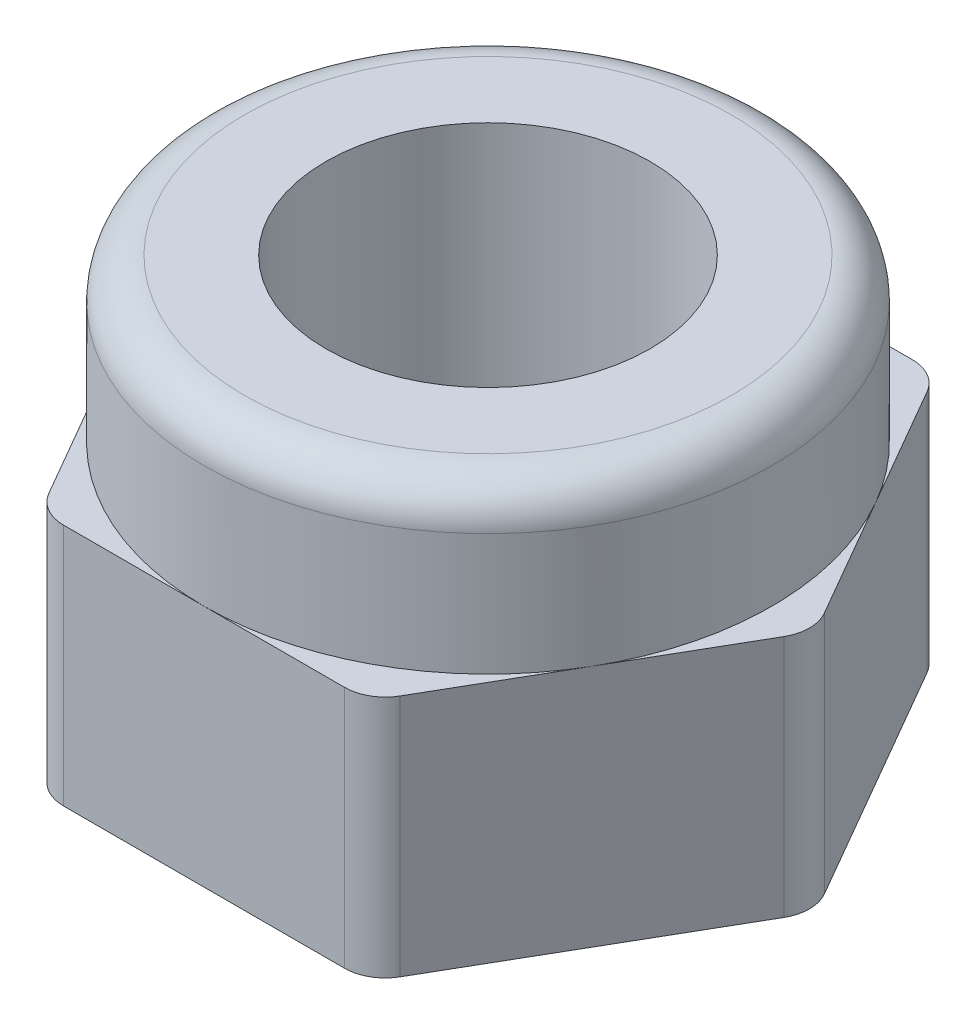
ISO-10303-21;
HEADER;
FILE_DESCRIPTION(('STEP AP214'),'2;1');
FILE_NAME('part.step','',(''),(''),'','','');
FILE_SCHEMA(('AUTOMOTIVE_DESIGN { 1 0 10303 214 1 1 1 1 }'));
ENDSEC;
DATA;
#1=APPLICATION_CONTEXT('core data for automotive mechanical design processes');
#2=APPLICATION_PROTOCOL_DEFINITION('international standard','automotive_design',2000,#1);
#3=PRODUCT_CONTEXT('',#1,'mechanical');
#4=PRODUCT('Part','Part','',(#3));
#5=PRODUCT_RELATED_PRODUCT_CATEGORY('part','',(#4));
#6=PRODUCT_DEFINITION_FORMATION('','',#4);
#7=PRODUCT_DEFINITION_CONTEXT('part definition',#1,'design');
#8=PRODUCT_DEFINITION('design','',#6,#7);
#9=PRODUCT_DEFINITION_SHAPE('','',#8);
#10=(LENGTH_UNIT() NAMED_UNIT(*) SI_UNIT(.MILLI.,.METRE.));
#11=(NAMED_UNIT(*) PLANE_ANGLE_UNIT() SI_UNIT($,.RADIAN.));
#12=(NAMED_UNIT(*) SI_UNIT($,.STERADIAN.) SOLID_ANGLE_UNIT());
#13=UNCERTAINTY_MEASURE_WITH_UNIT(LENGTH_MEASURE(1.E-05),#10,'distance_accuracy_value','');
#14=(GEOMETRIC_REPRESENTATION_CONTEXT(3) GLOBAL_UNCERTAINTY_ASSIGNED_CONTEXT((#13)) GLOBAL_UNIT_ASSIGNED_CONTEXT((#10,
#11,#12)) REPRESENTATION_CONTEXT('',''));
#15=CARTESIAN_POINT('',(0.,0.,0.));
#16=DIRECTION('',(0.,0.,1.));
#17=DIRECTION('',(1.,0.,0.));
#18=AXIS2_PLACEMENT_3D('',#15,#16,#17);
#19=CARTESIAN_POINT('',(0.,3.,0.));
#20=DIRECTION('',(0.,1.,0.));
#21=DIRECTION('',(0.,0.,1.));
#22=AXIS2_PLACEMENT_3D('',#19,#20,#21);
#23=PLANE('',#22);
#24=DIRECTION('',(1.,0.,0.));
#25=VECTOR('',#24,1.);
#26=CARTESIAN_POINT('',(-2.02072594216365,3.,3.50000000000001));
#27=LINE('',#26,#25);
#28=CARTESIAN_POINT('',(0.,3.,3.50000000000001));
#29=VERTEX_POINT('',#28);
#30=CARTESIAN_POINT('',(1.73205080756892,3.,3.49999999999998));
#31=VERTEX_POINT('',#30);
#32=EDGE_CURVE('E161',#29,#31,#27,.T.);
#33=ORIENTED_EDGE('',*,*,#32,.T.);
#34=CARTESIAN_POINT('',(1.73205080756891,3.,2.99999999999998));
#35=DIRECTION('',(0.,1.,0.));
#36=DIRECTION('',(0.,0.,1.));
#37=AXIS2_PLACEMENT_3D('',#34,#35,#36);
#38=CIRCLE('',#37,0.5);
#39=CARTESIAN_POINT('',(2.16506350946113,3.,3.24999999999997));
#40=VERTEX_POINT('',#39);
#41=EDGE_CURVE('E11',#31,#40,#38,.T.);
#42=ORIENTED_EDGE('',*,*,#41,.T.);
#43=DIRECTION('',(0.499999999999995,0.,-0.866025403784442));
#44=VECTOR('',#43,1.);
#45=CARTESIAN_POINT('',(2.02072594216373,3.,3.49999999999997));
#46=LINE('',#45,#44);
#47=CARTESIAN_POINT('',(3.03108891324555,3.,1.74999999999999));
#48=VERTEX_POINT('',#47);
#49=EDGE_CURVE('E172',#40,#48,#46,.T.);
#50=ORIENTED_EDGE('',*,*,#49,.T.);
#51=CARTESIAN_POINT('',(0.,3.,0.));
#52=DIRECTION('',(0.,1.,0.));
#53=DIRECTION('',(0.,0.,1.));
#54=AXIS2_PLACEMENT_3D('',#51,#52,#53);
#55=CIRCLE('',#54,3.50000000000001);
#56=EDGE_CURVE('E171',#29,#48,#55,.T.);
#57=ORIENTED_EDGE('',*,*,#56,.F.);
#58=EDGE_LOOP('',(#33,#42,#50,#57));
#59=FACE_BOUND('',#58,.T.);
#60=ADVANCED_FACE('F39',(#59),#23,.T.);
#61=CARTESIAN_POINT('',(3.89711431702997,3.,0.249999999999999));
#62=VERTEX_POINT('',#61);
#63=EDGE_CURVE('E198',#48,#62,#46,.T.);
#64=ORIENTED_EDGE('',*,*,#63,.T.);
#65=CARTESIAN_POINT('',(3.46410161513775,3.,0.));
#66=DIRECTION('',(0.,1.,0.));
#67=DIRECTION('',(0.,0.,1.));
#68=AXIS2_PLACEMENT_3D('',#65,#66,#67);
#69=CIRCLE('',#68,0.5);
#70=CARTESIAN_POINT('',(3.89711431702997,3.,-0.249999999999999));
#71=VERTEX_POINT('',#70);
#72=EDGE_CURVE('E48',#62,#71,#69,.T.);
#73=ORIENTED_EDGE('',*,*,#72,.T.);
#74=DIRECTION('',(-0.500000000000001,0.,-0.866025403784438));
#75=VECTOR('',#74,1.);
#76=CARTESIAN_POINT('',(4.04145188432738,3.,0.));
#77=LINE('',#76,#75);
#78=CARTESIAN_POINT('',(3.03108891324553,3.,-1.75));
#79=VERTEX_POINT('',#78);
#80=EDGE_CURVE('E199',#71,#79,#77,.T.);
#81=ORIENTED_EDGE('',*,*,#80,.T.);
#82=EDGE_CURVE('E180',#48,#79,#55,.T.);
#83=ORIENTED_EDGE('',*,*,#82,.F.);
#84=EDGE_LOOP('',(#64,#73,#81,#83));
#85=FACE_BOUND('',#84,.T.);
#86=ADVANCED_FACE('F313',(#85),#23,.T.);
#87=CARTESIAN_POINT('',(2.16506350946109,3.,-3.25));
#88=VERTEX_POINT('',#87);
#89=EDGE_CURVE('E197',#79,#88,#77,.T.);
#90=ORIENTED_EDGE('',*,*,#89,.T.);
#91=CARTESIAN_POINT('',(1.73205080756887,3.,-3.));
#92=DIRECTION('',(0.,1.,0.));
#93=DIRECTION('',(0.,0.,1.));
#94=AXIS2_PLACEMENT_3D('',#91,#92,#93);
#95=CIRCLE('',#94,0.5);
#96=CARTESIAN_POINT('',(1.73205080756887,3.,-3.5));
#97=VERTEX_POINT('',#96);
#98=EDGE_CURVE('E301',#88,#97,#95,.T.);
#99=ORIENTED_EDGE('',*,*,#98,.T.);
#100=DIRECTION('',(-1.,0.,0.));
#101=VECTOR('',#100,1.);
#102=CARTESIAN_POINT('',(2.02072594216368,3.,-3.5));
#103=LINE('',#102,#101);
#104=CARTESIAN_POINT('',(0.,3.,-3.49999999999999));
#105=VERTEX_POINT('',#104);
#106=EDGE_CURVE('E203',#97,#105,#103,.T.);
#107=ORIENTED_EDGE('',*,*,#106,.T.);
#108=EDGE_CURVE('E368',#79,#105,#55,.T.);
#109=ORIENTED_EDGE('',*,*,#108,.F.);
#110=EDGE_LOOP('',(#90,#99,#107,#109));
#111=FACE_BOUND('',#110,.T.);
#112=ADVANCED_FACE('F366',(#111),#23,.T.);
#113=CARTESIAN_POINT('',(-1.73205080756889,3.,-3.49999999999999));
#114=VERTEX_POINT('',#113);
#115=EDGE_CURVE('E202',#105,#114,#103,.T.);
#116=ORIENTED_EDGE('',*,*,#115,.T.);
#117=CARTESIAN_POINT('',(-1.73205080756889,3.,-2.99999999999999));
#118=DIRECTION('',(0.,1.,0.));
#119=DIRECTION('',(0.,0.,1.));
#120=AXIS2_PLACEMENT_3D('',#117,#118,#119);
#121=CIRCLE('',#120,0.5);
#122=CARTESIAN_POINT('',(-2.16506350946111,3.,-3.24999999999999));
#123=VERTEX_POINT('',#122);
#124=EDGE_CURVE('E291',#114,#123,#121,.T.);
#125=ORIENTED_EDGE('',*,*,#124,.T.);
#126=DIRECTION('',(-0.499999999999995,0.,0.866025403784442));
#127=VECTOR('',#126,1.);
#128=CARTESIAN_POINT('',(-2.0207259421637,3.,-3.49999999999999));
#129=LINE('',#128,#127);
#130=CARTESIAN_POINT('',(-3.03108891324554,3.,-1.74999999999998));
#131=VERTEX_POINT('',#130);
#132=EDGE_CURVE('E207',#123,#131,#129,.T.);
#133=ORIENTED_EDGE('',*,*,#132,.T.);
#134=EDGE_CURVE('E188',#105,#131,#55,.T.);
#135=ORIENTED_EDGE('',*,*,#134,.F.);
#136=EDGE_LOOP('',(#116,#125,#133,#135));
#137=FACE_BOUND('',#136,.T.);
#138=ADVANCED_FACE('F403',(#137),#23,.T.);
#139=CARTESIAN_POINT('',(-3.89711431702997,3.,-0.249999999999974));
#140=VERTEX_POINT('',#139);
#141=EDGE_CURVE('E206',#131,#140,#129,.T.);
#142=ORIENTED_EDGE('',*,*,#141,.T.);
#143=CARTESIAN_POINT('',(-3.46410161513775,3.,0.));
#144=DIRECTION('',(0.,1.,0.));
#145=DIRECTION('',(0.,0.,1.));
#146=AXIS2_PLACEMENT_3D('',#143,#144,#145);
#147=CIRCLE('',#146,0.5);
#148=CARTESIAN_POINT('',(-3.89711431702997,3.,0.250000000000028));
#149=VERTEX_POINT('',#148);
#150=EDGE_CURVE('E281',#140,#149,#147,.T.);
#151=ORIENTED_EDGE('',*,*,#150,.T.);
#152=DIRECTION('',(0.500000000000007,0.,0.866025403784435));
#153=VECTOR('',#152,1.);
#154=CARTESIAN_POINT('',(-4.04145188432738,3.,0.));
#155=LINE('',#154,#153);
#156=CARTESIAN_POINT('',(-3.03108891324552,3.,1.75000000000002));
#157=VERTEX_POINT('',#156);
#158=EDGE_CURVE('E169',#149,#157,#155,.T.);
#159=ORIENTED_EDGE('',*,*,#158,.T.);
#160=EDGE_CURVE('E185',#131,#157,#55,.T.);
#161=ORIENTED_EDGE('',*,*,#160,.F.);
#162=EDGE_LOOP('',(#142,#151,#159,#161));
#163=FACE_BOUND('',#162,.T.);
#164=ADVANCED_FACE('F398',(#163),#23,.T.);
#165=CARTESIAN_POINT('',(-2.16506350946106,3.,3.25000000000002));
#166=VERTEX_POINT('',#165);
#167=EDGE_CURVE('E210',#157,#166,#155,.T.);
#168=ORIENTED_EDGE('',*,*,#167,.T.);
#169=CARTESIAN_POINT('',(-1.73205080756885,3.,3.00000000000001));
#170=DIRECTION('',(0.,1.,0.));
#171=DIRECTION('',(0.,0.,1.));
#172=AXIS2_PLACEMENT_3D('',#169,#170,#171);
#173=CIRCLE('',#172,0.5);
#174=CARTESIAN_POINT('',(-1.73205080756884,3.,3.50000000000001));
#175=VERTEX_POINT('',#174);
#176=EDGE_CURVE('E156',#166,#175,#173,.T.);
#177=ORIENTED_EDGE('',*,*,#176,.T.);
#178=EDGE_CURVE('E148',#175,#29,#27,.T.);
#179=ORIENTED_EDGE('',*,*,#178,.T.);
#180=EDGE_CURVE('E153',#157,#29,#55,.T.);
#181=ORIENTED_EDGE('',*,*,#180,.F.);
#182=EDGE_LOOP('',(#168,#177,#179,#181));
#183=FACE_BOUND('',#182,.T.);
#184=ADVANCED_FACE('F151',(#183),#23,.T.);
#185=CARTESIAN_POINT('',(0.,0.,0.));
#186=DIRECTION('',(0.,1.,0.));
#187=DIRECTION('',(0.,0.,1.));
#188=AXIS2_PLACEMENT_3D('',#185,#186,#187);
#189=PLANE('',#188);
#190=DIRECTION('',(1.,0.,0.));
#191=VECTOR('',#190,1.);
#192=CARTESIAN_POINT('',(-2.02072594216365,0.,3.50000000000001));
#193=LINE('',#192,#191);
#194=CARTESIAN_POINT('',(-1.73205080756884,0.,3.50000000000001));
#195=VERTEX_POINT('',#194);
#196=CARTESIAN_POINT('',(1.73205080756892,0.,3.49999999999998));
#197=VERTEX_POINT('',#196);
#198=EDGE_CURVE('E231',#195,#197,#193,.T.);
#199=ORIENTED_EDGE('',*,*,#198,.F.);
#200=CARTESIAN_POINT('',(-1.73205080756885,0.,3.00000000000001));
#201=DIRECTION('',(0.,1.,0.));
#202=DIRECTION('',(0.,0.,1.));
#203=AXIS2_PLACEMENT_3D('',#200,#201,#202);
#204=CIRCLE('',#203,0.5);
#205=CARTESIAN_POINT('',(-2.16506350946106,0.,3.25000000000002));
#206=VERTEX_POINT('',#205);
#207=EDGE_CURVE('E262',#195,#206,#204,.F.);
#208=ORIENTED_EDGE('',*,*,#207,.T.);
#209=DIRECTION('',(0.500000000000007,0.,0.866025403784435));
#210=VECTOR('',#209,1.);
#211=CARTESIAN_POINT('',(-4.04145188432738,0.,0.));
#212=LINE('',#211,#210);
#213=CARTESIAN_POINT('',(-3.89711431702997,0.,0.250000000000028));
#214=VERTEX_POINT('',#213);
#215=EDGE_CURVE('E227',#214,#206,#212,.T.);
#216=ORIENTED_EDGE('',*,*,#215,.F.);
#217=CARTESIAN_POINT('',(-3.46410161513775,0.,0.));
#218=DIRECTION('',(0.,1.,0.));
#219=DIRECTION('',(0.,0.,1.));
#220=AXIS2_PLACEMENT_3D('',#217,#218,#219);
#221=CIRCLE('',#220,0.5);
#222=CARTESIAN_POINT('',(-3.89711431702997,0.,-0.249999999999974));
#223=VERTEX_POINT('',#222);
#224=EDGE_CURVE('E259',#214,#223,#221,.F.);
#225=ORIENTED_EDGE('',*,*,#224,.T.);
#226=DIRECTION('',(-0.499999999999995,0.,0.866025403784442));
#227=VECTOR('',#226,1.);
#228=CARTESIAN_POINT('',(-2.0207259421637,0.,-3.49999999999999));
#229=LINE('',#228,#227);
#230=CARTESIAN_POINT('',(-2.16506350946111,0.,-3.24999999999999));
#231=VERTEX_POINT('',#230);
#232=EDGE_CURVE('E223',#231,#223,#229,.T.);
#233=ORIENTED_EDGE('',*,*,#232,.F.);
#234=CARTESIAN_POINT('',(-1.73205080756889,0.,-2.99999999999999));
#235=DIRECTION('',(0.,1.,0.));
#236=DIRECTION('',(0.,0.,1.));
#237=AXIS2_PLACEMENT_3D('',#234,#235,#236);
#238=CIRCLE('',#237,0.5);
#239=CARTESIAN_POINT('',(-1.73205080756889,0.,-3.49999999999999));
#240=VERTEX_POINT('',#239);
#241=EDGE_CURVE('E256',#231,#240,#238,.F.);
#242=ORIENTED_EDGE('',*,*,#241,.T.);
#243=DIRECTION('',(-1.,0.,0.));
#244=VECTOR('',#243,1.);
#245=CARTESIAN_POINT('',(2.02072594216368,0.,-3.5));
#246=LINE('',#245,#244);
#247=CARTESIAN_POINT('',(1.73205080756887,0.,-3.5));
#248=VERTEX_POINT('',#247);
#249=EDGE_CURVE('E219',#248,#240,#246,.T.);
#250=ORIENTED_EDGE('',*,*,#249,.F.);
#251=CARTESIAN_POINT('',(1.73205080756887,0.,-3.));
#252=DIRECTION('',(0.,1.,0.));
#253=DIRECTION('',(0.,0.,1.));
#254=AXIS2_PLACEMENT_3D('',#251,#252,#253);
#255=CIRCLE('',#254,0.5);
#256=CARTESIAN_POINT('',(2.16506350946109,0.,-3.25));
#257=VERTEX_POINT('',#256);
#258=EDGE_CURVE('E253',#248,#257,#255,.F.);
#259=ORIENTED_EDGE('',*,*,#258,.T.);
#260=DIRECTION('',(-0.500000000000001,0.,-0.866025403784438));
#261=VECTOR('',#260,1.);
#262=CARTESIAN_POINT('',(4.04145188432738,0.,0.));
#263=LINE('',#262,#261);
#264=CARTESIAN_POINT('',(3.89711431702997,0.,-0.249999999999999));
#265=VERTEX_POINT('',#264);
#266=EDGE_CURVE('E215',#265,#257,#263,.T.);
#267=ORIENTED_EDGE('',*,*,#266,.F.);
#268=CARTESIAN_POINT('',(3.46410161513775,0.,0.));
#269=DIRECTION('',(0.,1.,0.));
#270=DIRECTION('',(0.,0.,1.));
#271=AXIS2_PLACEMENT_3D('',#268,#269,#270);
#272=CIRCLE('',#271,0.5);
#273=CARTESIAN_POINT('',(3.89711431702997,0.,0.249999999999999));
#274=VERTEX_POINT('',#273);
#275=EDGE_CURVE('E250',#265,#274,#272,.F.);
#276=ORIENTED_EDGE('',*,*,#275,.T.);
#277=DIRECTION('',(0.499999999999995,0.,-0.866025403784442));
#278=VECTOR('',#277,1.);
#279=CARTESIAN_POINT('',(2.02072594216373,0.,3.49999999999997));
#280=LINE('',#279,#278);
#281=CARTESIAN_POINT('',(2.16506350946113,0.,3.24999999999997));
#282=VERTEX_POINT('',#281);
#283=EDGE_CURVE('E194',#282,#274,#280,.T.);
#284=ORIENTED_EDGE('',*,*,#283,.F.);
#285=CARTESIAN_POINT('',(1.73205080756891,0.,2.99999999999998));
#286=DIRECTION('',(0.,1.,0.));
#287=DIRECTION('',(0.,0.,1.));
#288=AXIS2_PLACEMENT_3D('',#285,#286,#287);
#289=CIRCLE('',#288,0.5);
#290=EDGE_CURVE('E247',#282,#197,#289,.F.);
#291=ORIENTED_EDGE('',*,*,#290,.T.);
#292=EDGE_LOOP('',(#199,#208,#216,#225,#233,#242,#250,#259,#267,#276,#284,#291));
#293=FACE_BOUND('',#292,.T.);
#294=CARTESIAN_POINT('',(0.,0.,0.));
#295=DIRECTION('',(0.,1.,0.));
#296=DIRECTION('',(0.,0.,1.));
#297=AXIS2_PLACEMENT_3D('',#294,#295,#296);
#298=CIRCLE('',#297,2.);
#299=CARTESIAN_POINT('',(0.,0.,2.));
#300=VERTEX_POINT('',#299);
#301=EDGE_CURVE('E177',#300,#300,#298,.T.);
#302=ORIENTED_EDGE('',*,*,#301,.T.);
#303=EDGE_LOOP('',(#302));
#304=FACE_BOUND('',#303,.T.);
#305=ADVANCED_FACE('F326',(#293,#304),#189,.F.);
#306=CARTESIAN_POINT('',(2.02072594216373,3.,3.49999999999997));
#307=DIRECTION('',(-0.866025403784441,0.,-0.499999999999995));
#308=DIRECTION('',(-0.499999999999995,0.,0.866025403784442));
#309=AXIS2_PLACEMENT_3D('',#306,#307,#308);
#310=PLANE('',#309);
#311=ORIENTED_EDGE('',*,*,#283,.T.);
#312=DIRECTION('',(0.,-1.,0.));
#313=VECTOR('',#312,1.);
#314=CARTESIAN_POINT('',(3.89711431702997,3.,0.249999999999999));
#315=LINE('',#314,#313);
#316=EDGE_CURVE('E61',#274,#62,#315,.F.);
#317=ORIENTED_EDGE('',*,*,#316,.T.);
#318=ORIENTED_EDGE('',*,*,#63,.F.);
#319=ORIENTED_EDGE('',*,*,#49,.F.);
#320=DIRECTION('',(0.,-1.,0.));
#321=VECTOR('',#320,1.);
#322=CARTESIAN_POINT('',(2.16506350946113,3.,3.24999999999997));
#323=LINE('',#322,#321);
#324=EDGE_CURVE('E304',#40,#282,#323,.T.);
#325=ORIENTED_EDGE('',*,*,#324,.T.);
#326=EDGE_LOOP('',(#311,#317,#318,#319,#325));
#327=FACE_BOUND('',#326,.T.);
#328=ADVANCED_FACE('F328',(#327),#310,.F.);
#329=CARTESIAN_POINT('',(4.04145188432738,3.,0.));
#330=DIRECTION('',(-0.866025403784438,0.,0.500000000000001));
#331=DIRECTION('',(0.500000000000001,0.,0.866025403784438));
#332=AXIS2_PLACEMENT_3D('',#329,#330,#331);
#333=PLANE('',#332);
#334=ORIENTED_EDGE('',*,*,#266,.T.);
#335=DIRECTION('',(0.,-1.,0.));
#336=VECTOR('',#335,1.);
#337=CARTESIAN_POINT('',(2.16506350946109,3.,-3.25));
#338=LINE('',#337,#336);
#339=EDGE_CURVE('E298',#257,#88,#338,.F.);
#340=ORIENTED_EDGE('',*,*,#339,.T.);
#341=ORIENTED_EDGE('',*,*,#89,.F.);
#342=ORIENTED_EDGE('',*,*,#80,.F.);
#343=DIRECTION('',(0.,-1.,0.));
#344=VECTOR('',#343,1.);
#345=CARTESIAN_POINT('',(3.89711431702997,3.,-0.249999999999999));
#346=LINE('',#345,#344);
#347=EDGE_CURVE('E294',#71,#265,#346,.T.);
#348=ORIENTED_EDGE('',*,*,#347,.T.);
#349=EDGE_LOOP('',(#334,#340,#341,#342,#348));
#350=FACE_BOUND('',#349,.T.);
#351=ADVANCED_FACE('F319',(#350),#333,.F.);
#352=CARTESIAN_POINT('',(2.02072594216368,3.,-3.5));
#353=DIRECTION('',(0.,0.,1.));
#354=DIRECTION('',(1.,0.,0.));
#355=AXIS2_PLACEMENT_3D('',#352,#353,#354);
#356=PLANE('',#355);
#357=ORIENTED_EDGE('',*,*,#249,.T.);
#358=DIRECTION('',(0.,-1.,0.));
#359=VECTOR('',#358,1.);
#360=CARTESIAN_POINT('',(-1.73205080756889,3.,-3.49999999999999));
#361=LINE('',#360,#359);
#362=EDGE_CURVE('E288',#240,#114,#361,.F.);
#363=ORIENTED_EDGE('',*,*,#362,.T.);
#364=ORIENTED_EDGE('',*,*,#115,.F.);
#365=ORIENTED_EDGE('',*,*,#106,.F.);
#366=DIRECTION('',(0.,-1.,0.));
#367=VECTOR('',#366,1.);
#368=CARTESIAN_POINT('',(1.73205080756887,3.,-3.5));
#369=LINE('',#368,#367);
#370=EDGE_CURVE('E284',#97,#248,#369,.T.);
#371=ORIENTED_EDGE('',*,*,#370,.T.);
#372=EDGE_LOOP('',(#357,#363,#364,#365,#371));
#373=FACE_BOUND('',#372,.T.);
#374=ADVANCED_FACE('F356',(#373),#356,.F.);
#375=CARTESIAN_POINT('',(-2.0207259421637,3.,-3.49999999999999));
#376=DIRECTION('',(0.866025403784442,0.,0.499999999999995));
#377=DIRECTION('',(0.499999999999995,0.,-0.866025403784442));
#378=AXIS2_PLACEMENT_3D('',#375,#376,#377);
#379=PLANE('',#378);
#380=ORIENTED_EDGE('',*,*,#232,.T.);
#381=DIRECTION('',(0.,-1.,0.));
#382=VECTOR('',#381,1.);
#383=CARTESIAN_POINT('',(-3.89711431702997,3.,-0.249999999999973));
#384=LINE('',#383,#382);
#385=EDGE_CURVE('E278',#223,#140,#384,.F.);
#386=ORIENTED_EDGE('',*,*,#385,.T.);
#387=ORIENTED_EDGE('',*,*,#141,.F.);
#388=ORIENTED_EDGE('',*,*,#132,.F.);
#389=DIRECTION('',(0.,-1.,0.));
#390=VECTOR('',#389,1.);
#391=CARTESIAN_POINT('',(-2.16506350946111,3.,-3.24999999999999));
#392=LINE('',#391,#390);
#393=EDGE_CURVE('E274',#123,#231,#392,.T.);
#394=ORIENTED_EDGE('',*,*,#393,.T.);
#395=EDGE_LOOP('',(#380,#386,#387,#388,#394));
#396=FACE_BOUND('',#395,.T.);
#397=ADVANCED_FACE('F345',(#396),#379,.F.);
#398=CARTESIAN_POINT('',(-4.04145188432738,3.,0.));
#399=DIRECTION('',(0.866025403784434,0.,-0.500000000000007));
#400=DIRECTION('',(-0.500000000000007,0.,-0.866025403784435));
#401=AXIS2_PLACEMENT_3D('',#398,#399,#400);
#402=PLANE('',#401);
#403=ORIENTED_EDGE('',*,*,#215,.T.);
#404=DIRECTION('',(0.,-1.,0.));
#405=VECTOR('',#404,1.);
#406=CARTESIAN_POINT('',(-2.16506350946106,3.,3.25000000000002));
#407=LINE('',#406,#405);
#408=EDGE_CURVE('E269',#206,#166,#407,.F.);
#409=ORIENTED_EDGE('',*,*,#408,.T.);
#410=ORIENTED_EDGE('',*,*,#167,.F.);
#411=ORIENTED_EDGE('',*,*,#158,.F.);
#412=DIRECTION('',(0.,-1.,0.));
#413=VECTOR('',#412,1.);
#414=CARTESIAN_POINT('',(-3.89711431702997,3.,0.250000000000028));
#415=LINE('',#414,#413);
#416=EDGE_CURVE('E265',#149,#214,#415,.T.);
#417=ORIENTED_EDGE('',*,*,#416,.T.);
#418=EDGE_LOOP('',(#403,#409,#410,#411,#417));
#419=FACE_BOUND('',#418,.T.);
#420=ADVANCED_FACE('F336',(#419),#402,.F.);
#421=CARTESIAN_POINT('',(-2.02072594216365,3.,3.50000000000001));
#422=DIRECTION('',(0.,0.,-1.));
#423=DIRECTION('',(-1.,0.,0.));
#424=AXIS2_PLACEMENT_3D('',#421,#422,#423);
#425=PLANE('',#424);
#426=ORIENTED_EDGE('',*,*,#178,.F.);
#427=DIRECTION('',(0.,-1.,0.));
#428=VECTOR('',#427,1.);
#429=CARTESIAN_POINT('',(-1.73205080756884,3.,3.50000000000001));
#430=LINE('',#429,#428);
#431=EDGE_CURVE('E244',#175,#195,#430,.T.);
#432=ORIENTED_EDGE('',*,*,#431,.T.);
#433=ORIENTED_EDGE('',*,*,#198,.T.);
#434=DIRECTION('',(0.,-1.,0.));
#435=VECTOR('',#434,1.);
#436=CARTESIAN_POINT('',(1.73205080756892,3.,3.49999999999998));
#437=LINE('',#436,#435);
#438=EDGE_CURVE('E167',#197,#31,#437,.F.);
#439=ORIENTED_EDGE('',*,*,#438,.T.);
#440=ORIENTED_EDGE('',*,*,#32,.F.);
#441=EDGE_LOOP('',(#426,#432,#433,#439,#440));
#442=FACE_BOUND('',#441,.T.);
#443=ADVANCED_FACE('F164',(#442),#425,.F.);
#444=CARTESIAN_POINT('',(0.,3.,0.));
#445=DIRECTION('',(0.,-1.,0.));
#446=DIRECTION('',(0.,0.,-1.));
#447=AXIS2_PLACEMENT_3D('',#444,#445,#446);
#448=CYLINDRICAL_SURFACE('',#447,2.);
#449=ORIENTED_EDGE('',*,*,#301,.F.);
#450=EDGE_LOOP('',(#449));
#451=FACE_BOUND('',#450,.T.);
#452=CARTESIAN_POINT('',(0.,5.,0.));
#453=DIRECTION('',(0.,1.,0.));
#454=DIRECTION('',(0.,0.,1.));
#455=AXIS2_PLACEMENT_3D('',#452,#453,#454);
#456=CIRCLE('',#455,2.);
#457=CARTESIAN_POINT('',(0.,5.,2.));
#458=VERTEX_POINT('',#457);
#459=EDGE_CURVE('E178',#458,#458,#456,.T.);
#460=ORIENTED_EDGE('',*,*,#459,.T.);
#461=EDGE_LOOP('',(#460));
#462=FACE_BOUND('',#461,.T.);
#463=ADVANCED_FACE('F376',(#451,#462),#448,.F.);
#464=CARTESIAN_POINT('',(0.,5.,0.));
#465=DIRECTION('',(0.,1.,0.));
#466=DIRECTION('',(0.,0.,1.));
#467=AXIS2_PLACEMENT_3D('',#464,#465,#466);
#468=PLANE('',#467);
#469=CARTESIAN_POINT('',(0.,5.,0.));
#470=DIRECTION('',(0.,1.,0.));
#471=DIRECTION('',(0.,0.,1.));
#472=AXIS2_PLACEMENT_3D('',#469,#470,#471);
#473=CIRCLE('',#472,3.00000000000001);
#474=CARTESIAN_POINT('',(0.,5.,3.00000000000001));
#475=VERTEX_POINT('',#474);
#476=EDGE_CURVE('E234',#475,#475,#473,.T.);
#477=ORIENTED_EDGE('',*,*,#476,.T.);
#478=EDGE_LOOP('',(#477));
#479=FACE_BOUND('',#478,.T.);
#480=ORIENTED_EDGE('',*,*,#459,.F.);
#481=EDGE_LOOP('',(#480));
#482=FACE_BOUND('',#481,.T.);
#483=ADVANCED_FACE('F378',(#479,#482),#468,.T.);
#484=CARTESIAN_POINT('',(0.,5.,0.));
#485=DIRECTION('',(0.,-1.,0.));
#486=DIRECTION('',(0.,0.,-1.));
#487=AXIS2_PLACEMENT_3D('',#484,#485,#486);
#488=CYLINDRICAL_SURFACE('',#487,3.50000000000001);
#489=CARTESIAN_POINT('',(0.,4.5,0.));
#490=DIRECTION('',(0.,1.,0.));
#491=DIRECTION('',(0.,0.,1.));
#492=AXIS2_PLACEMENT_3D('',#489,#490,#491);
#493=CIRCLE('',#492,3.50000000000001);
#494=CARTESIAN_POINT('',(0.,4.5,3.50000000000001));
#495=VERTEX_POINT('',#494);
#496=EDGE_CURVE('E238',#495,#495,#493,.F.);
#497=ORIENTED_EDGE('',*,*,#496,.T.);
#498=EDGE_LOOP('',(#497));
#499=FACE_BOUND('',#498,.T.);
#500=ORIENTED_EDGE('',*,*,#56,.T.);
#501=ORIENTED_EDGE('',*,*,#82,.T.);
#502=ORIENTED_EDGE('',*,*,#108,.T.);
#503=ORIENTED_EDGE('',*,*,#134,.T.);
#504=ORIENTED_EDGE('',*,*,#160,.T.);
#505=ORIENTED_EDGE('',*,*,#180,.T.);
#506=EDGE_LOOP('',(#500,#501,#502,#503,#504,#505));
#507=FACE_BOUND('',#506,.T.);
#508=ADVANCED_FACE('F182',(#499,#507),#488,.T.);
#509=CARTESIAN_POINT('',(0.,4.5,0.));
#510=DIRECTION('',(0.,1.,0.));
#511=DIRECTION('',(0.,0.,1.));
#512=AXIS2_PLACEMENT_3D('',#509,#510,#511);
#513=TOROIDAL_SURFACE('',#512,3.00000000000001,0.5);
#514=ORIENTED_EDGE('',*,*,#496,.F.);
#515=EDGE_LOOP('',(#514));
#516=FACE_BOUND('',#515,.T.);
#517=ORIENTED_EDGE('',*,*,#476,.F.);
#518=EDGE_LOOP('',(#517));
#519=FACE_BOUND('',#518,.T.);
#520=ADVANCED_FACE('F386',(#516,#519),#513,.T.);
#521=CARTESIAN_POINT('',(-1.73205080756885,3.,3.00000000000001));
#522=DIRECTION('',(0.,-1.,0.));
#523=DIRECTION('',(0.,0.,-1.));
#524=AXIS2_PLACEMENT_3D('',#521,#522,#523);
#525=CYLINDRICAL_SURFACE('',#524,0.5);
#526=ORIENTED_EDGE('',*,*,#176,.F.);
#527=ORIENTED_EDGE('',*,*,#408,.F.);
#528=ORIENTED_EDGE('',*,*,#207,.F.);
#529=ORIENTED_EDGE('',*,*,#431,.F.);
#530=EDGE_LOOP('',(#526,#527,#528,#529));
#531=FACE_BOUND('',#530,.T.);
#532=ADVANCED_FACE('F332',(#531),#525,.T.);
#533=CARTESIAN_POINT('',(-3.46410161513775,3.,0.));
#534=DIRECTION('',(0.,-1.,0.));
#535=DIRECTION('',(0.,0.,-1.));
#536=AXIS2_PLACEMENT_3D('',#533,#534,#535);
#537=CYLINDRICAL_SURFACE('',#536,0.5);
#538=ORIENTED_EDGE('',*,*,#150,.F.);
#539=ORIENTED_EDGE('',*,*,#385,.F.);
#540=ORIENTED_EDGE('',*,*,#224,.F.);
#541=ORIENTED_EDGE('',*,*,#416,.F.);
#542=EDGE_LOOP('',(#538,#539,#540,#541));
#543=FACE_BOUND('',#542,.T.);
#544=ADVANCED_FACE('F341',(#543),#537,.T.);
#545=CARTESIAN_POINT('',(-1.73205080756889,3.,-2.99999999999999));
#546=DIRECTION('',(0.,-1.,0.));
#547=DIRECTION('',(0.,0.,-1.));
#548=AXIS2_PLACEMENT_3D('',#545,#546,#547);
#549=CYLINDRICAL_SURFACE('',#548,0.5);
#550=ORIENTED_EDGE('',*,*,#124,.F.);
#551=ORIENTED_EDGE('',*,*,#362,.F.);
#552=ORIENTED_EDGE('',*,*,#241,.F.);
#553=ORIENTED_EDGE('',*,*,#393,.F.);
#554=EDGE_LOOP('',(#550,#551,#552,#553));
#555=FACE_BOUND('',#554,.T.);
#556=ADVANCED_FACE('F352',(#555),#549,.T.);
#557=CARTESIAN_POINT('',(1.73205080756887,3.,-3.));
#558=DIRECTION('',(0.,-1.,0.));
#559=DIRECTION('',(0.,0.,-1.));
#560=AXIS2_PLACEMENT_3D('',#557,#558,#559);
#561=CYLINDRICAL_SURFACE('',#560,0.5);
#562=ORIENTED_EDGE('',*,*,#98,.F.);
#563=ORIENTED_EDGE('',*,*,#339,.F.);
#564=ORIENTED_EDGE('',*,*,#258,.F.);
#565=ORIENTED_EDGE('',*,*,#370,.F.);
#566=EDGE_LOOP('',(#562,#563,#564,#565));
#567=FACE_BOUND('',#566,.T.);
#568=ADVANCED_FACE('F363',(#567),#561,.T.);
#569=CARTESIAN_POINT('',(3.46410161513775,3.,0.));
#570=DIRECTION('',(0.,-1.,0.));
#571=DIRECTION('',(0.,0.,-1.));
#572=AXIS2_PLACEMENT_3D('',#569,#570,#571);
#573=CYLINDRICAL_SURFACE('',#572,0.5);
#574=ORIENTED_EDGE('',*,*,#72,.F.);
#575=ORIENTED_EDGE('',*,*,#316,.F.);
#576=ORIENTED_EDGE('',*,*,#275,.F.);
#577=ORIENTED_EDGE('',*,*,#347,.F.);
#578=EDGE_LOOP('',(#574,#575,#576,#577));
#579=FACE_BOUND('',#578,.T.);
#580=ADVANCED_FACE('F322',(#579),#573,.T.);
#581=CARTESIAN_POINT('',(1.73205080756891,3.,2.99999999999998));
#582=DIRECTION('',(0.,-1.,0.));
#583=DIRECTION('',(0.,0.,-1.));
#584=AXIS2_PLACEMENT_3D('',#581,#582,#583);
#585=CYLINDRICAL_SURFACE('',#584,0.5);
#586=ORIENTED_EDGE('',*,*,#41,.F.);
#587=ORIENTED_EDGE('',*,*,#438,.F.);
#588=ORIENTED_EDGE('',*,*,#290,.F.);
#589=ORIENTED_EDGE('',*,*,#324,.F.);
#590=EDGE_LOOP('',(#586,#587,#588,#589));
#591=FACE_BOUND('',#590,.T.);
#592=ADVANCED_FACE('F41',(#591),#585,.T.);
#593=CLOSED_SHELL('',(#60,#86,#112,#138,#164,#184,#305,#328,#351,#374,#397,#420,#443,#463,#483,
#508,#520,#532,#544,#556,#568,#580,#592));
#594=MANIFOLD_SOLID_BREP('B2',#593);
#595=ADVANCED_BREP_SHAPE_REPRESENTATION('',(#18,#594),#14);
#596=SHAPE_DEFINITION_REPRESENTATION(#9,#595);
ENDSEC;
END-ISO-10303-21;
